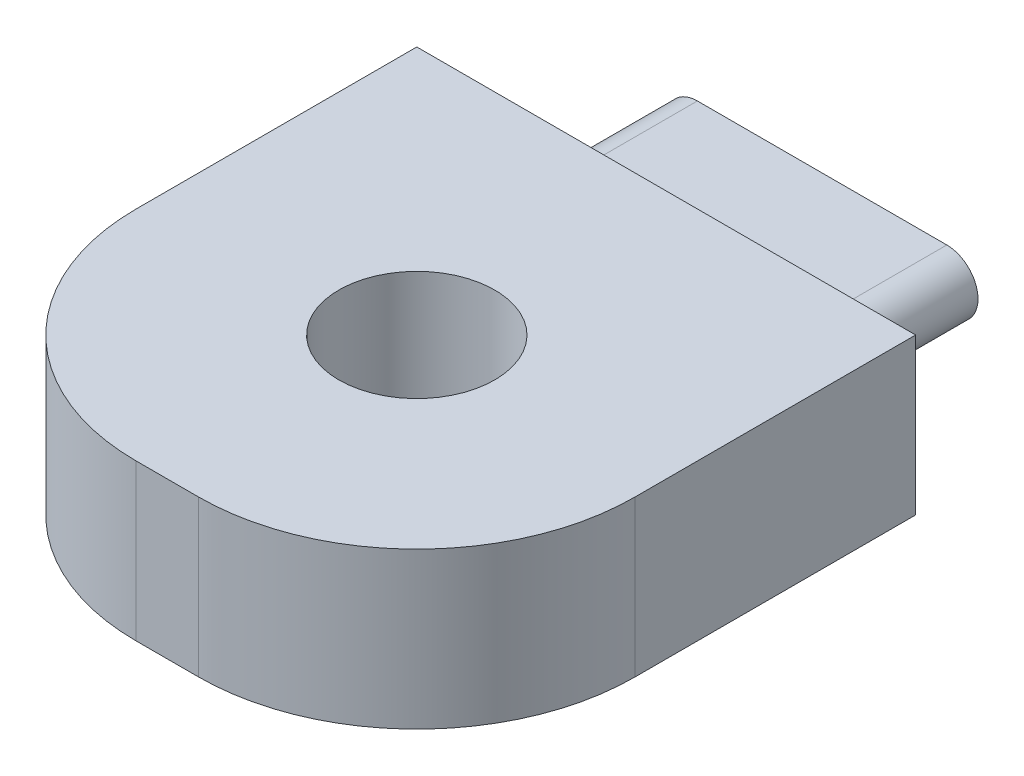
ISO-10303-21;
HEADER;
FILE_DESCRIPTION(('STEP AP214'),'2;1');
FILE_NAME('part.step','',(''),(''),'','','');
FILE_SCHEMA(('AUTOMOTIVE_DESIGN { 1 0 10303 214 1 1 1 1 }'));
ENDSEC;
DATA;
#1=APPLICATION_CONTEXT('core data for automotive mechanical design processes');
#2=APPLICATION_PROTOCOL_DEFINITION('international standard','automotive_design',2000,#1);
#3=PRODUCT_CONTEXT('',#1,'mechanical');
#4=PRODUCT('Part','Part','',(#3));
#5=PRODUCT_RELATED_PRODUCT_CATEGORY('part','',(#4));
#6=PRODUCT_DEFINITION_FORMATION('','',#4);
#7=PRODUCT_DEFINITION_CONTEXT('part definition',#1,'design');
#8=PRODUCT_DEFINITION('design','',#6,#7);
#9=PRODUCT_DEFINITION_SHAPE('','',#8);
#10=(LENGTH_UNIT() NAMED_UNIT(*) SI_UNIT(.MILLI.,.METRE.));
#11=(NAMED_UNIT(*) PLANE_ANGLE_UNIT() SI_UNIT($,.RADIAN.));
#12=(NAMED_UNIT(*) SI_UNIT($,.STERADIAN.) SOLID_ANGLE_UNIT());
#13=UNCERTAINTY_MEASURE_WITH_UNIT(LENGTH_MEASURE(1.E-05),#10,'distance_accuracy_value','');
#14=(GEOMETRIC_REPRESENTATION_CONTEXT(3) GLOBAL_UNCERTAINTY_ASSIGNED_CONTEXT((#13)) GLOBAL_UNIT_ASSIGNED_CONTEXT((#10,
#11,#12)) REPRESENTATION_CONTEXT('',''));
#15=CARTESIAN_POINT('',(0.,0.,0.));
#16=DIRECTION('',(0.,0.,1.));
#17=DIRECTION('',(1.,0.,0.));
#18=AXIS2_PLACEMENT_3D('',#15,#16,#17);
#19=CARTESIAN_POINT('',(8.,5.,0.));
#20=DIRECTION('',(0.,0.,1.));
#21=DIRECTION('',(1.,0.,0.));
#22=AXIS2_PLACEMENT_3D('',#19,#20,#21);
#23=PLANE('',#22);
#24=DIRECTION('',(-1.,0.,0.));
#25=VECTOR('',#24,1.);
#26=CARTESIAN_POINT('',(8.,0.,0.));
#27=LINE('',#26,#25);
#28=CARTESIAN_POINT('',(8.,0.,0.));
#29=VERTEX_POINT('',#28);
#30=CARTESIAN_POINT('',(-8.,0.,0.));
#31=VERTEX_POINT('',#30);
#32=EDGE_CURVE('E138',#29,#31,#27,.T.);
#33=ORIENTED_EDGE('',*,*,#32,.T.);
#34=DIRECTION('',(0.,-1.,0.));
#35=VECTOR('',#34,1.);
#36=CARTESIAN_POINT('',(-8.,5.,0.));
#37=LINE('',#36,#35);
#38=CARTESIAN_POINT('',(-8.,5.,0.));
#39=VERTEX_POINT('',#38);
#40=EDGE_CURVE('E11',#39,#31,#37,.T.);
#41=ORIENTED_EDGE('',*,*,#40,.F.);
#42=DIRECTION('',(-1.,0.,0.));
#43=VECTOR('',#42,1.);
#44=CARTESIAN_POINT('',(8.,5.,0.));
#45=LINE('',#44,#43);
#46=CARTESIAN_POINT('',(8.,5.,0.));
#47=VERTEX_POINT('',#46);
#48=EDGE_CURVE('E140',#47,#39,#45,.T.);
#49=ORIENTED_EDGE('',*,*,#48,.F.);
#50=DIRECTION('',(0.,-1.,0.));
#51=VECTOR('',#50,1.);
#52=CARTESIAN_POINT('',(8.,5.,0.));
#53=LINE('',#52,#51);
#54=EDGE_CURVE('E154',#47,#29,#53,.T.);
#55=ORIENTED_EDGE('',*,*,#54,.T.);
#56=EDGE_LOOP('',(#33,#41,#49,#55));
#57=FACE_BOUND('',#56,.T.);
#58=CARTESIAN_POINT('',(4.,2.,0.));
#59=DIRECTION('',(0.,0.,-1.));
#60=DIRECTION('',(-1.,0.,0.));
#61=AXIS2_PLACEMENT_3D('',#58,#59,#60);
#62=CIRCLE('',#61,1.);
#63=CARTESIAN_POINT('',(4.,3.,0.));
#64=VERTEX_POINT('',#63);
#65=CARTESIAN_POINT('',(4.,0.999999999999998,0.));
#66=VERTEX_POINT('',#65);
#67=EDGE_CURVE('E46',#64,#66,#62,.T.);
#68=ORIENTED_EDGE('',*,*,#67,.F.);
#69=DIRECTION('',(1.,0.,0.));
#70=VECTOR('',#69,1.);
#71=CARTESIAN_POINT('',(4.,3.,0.));
#72=LINE('',#71,#70);
#73=CARTESIAN_POINT('',(-4.,3.,0.));
#74=VERTEX_POINT('',#73);
#75=EDGE_CURVE('E50',#74,#64,#72,.T.);
#76=ORIENTED_EDGE('',*,*,#75,.F.);
#77=CARTESIAN_POINT('',(-4.,2.,0.));
#78=DIRECTION('',(0.,0.,-1.));
#79=DIRECTION('',(-1.,0.,0.));
#80=AXIS2_PLACEMENT_3D('',#77,#78,#79);
#81=CIRCLE('',#80,1.);
#82=CARTESIAN_POINT('',(-4.,1.,0.));
#83=VERTEX_POINT('',#82);
#84=EDGE_CURVE('E329',#83,#74,#81,.T.);
#85=ORIENTED_EDGE('',*,*,#84,.F.);
#86=DIRECTION('',(-1.,0.,0.));
#87=VECTOR('',#86,1.);
#88=CARTESIAN_POINT('',(4.,0.999999999999998,0.));
#89=LINE('',#88,#87);
#90=EDGE_CURVE('E335',#66,#83,#89,.T.);
#91=ORIENTED_EDGE('',*,*,#90,.F.);
#92=EDGE_LOOP('',(#68,#76,#85,#91));
#93=FACE_BOUND('',#92,.T.);
#94=ADVANCED_FACE('F32',(#57,#93),#23,.F.);
#95=CARTESIAN_POINT('',(-1.,5.,9.));
#96=DIRECTION('',(0.,1.,0.));
#97=DIRECTION('',(0.,0.,1.));
#98=AXIS2_PLACEMENT_3D('',#95,#96,#97);
#99=PLANE('',#98);
#100=ORIENTED_EDGE('',*,*,#48,.T.);
#101=DIRECTION('',(0.,0.,1.));
#102=VECTOR('',#101,1.);
#103=CARTESIAN_POINT('',(-8.,5.,0.));
#104=LINE('',#103,#102);
#105=CARTESIAN_POINT('',(-8.,5.,8.99999999999995));
#106=VERTEX_POINT('',#105);
#107=EDGE_CURVE('E143',#39,#106,#104,.T.);
#108=ORIENTED_EDGE('',*,*,#107,.T.);
#109=CARTESIAN_POINT('',(-1.,5.,9.));
#110=DIRECTION('',(0.,1.,0.));
#111=DIRECTION('',(0.,0.,1.));
#112=AXIS2_PLACEMENT_3D('',#109,#110,#111);
#113=CIRCLE('',#112,7.);
#114=CARTESIAN_POINT('',(-1.,5.,16.));
#115=VERTEX_POINT('',#114);
#116=EDGE_CURVE('E146',#106,#115,#113,.T.);
#117=ORIENTED_EDGE('',*,*,#116,.T.);
#118=DIRECTION('',(1.,0.,0.));
#119=VECTOR('',#118,1.);
#120=CARTESIAN_POINT('',(-0.999999999999954,5.,16.));
#121=LINE('',#120,#119);
#122=CARTESIAN_POINT('',(0.999999999999947,5.,16.));
#123=VERTEX_POINT('',#122);
#124=EDGE_CURVE('E148',#115,#123,#121,.T.);
#125=ORIENTED_EDGE('',*,*,#124,.T.);
#126=CARTESIAN_POINT('',(0.999999999999998,5.,9.));
#127=DIRECTION('',(0.,1.,0.));
#128=DIRECTION('',(0.,0.,1.));
#129=AXIS2_PLACEMENT_3D('',#126,#127,#128);
#130=CIRCLE('',#129,7.);
#131=CARTESIAN_POINT('',(8.,5.,8.99999999999995));
#132=VERTEX_POINT('',#131);
#133=EDGE_CURVE('E150',#123,#132,#130,.T.);
#134=ORIENTED_EDGE('',*,*,#133,.T.);
#135=DIRECTION('',(0.,0.,-1.));
#136=VECTOR('',#135,1.);
#137=CARTESIAN_POINT('',(8.,5.,0.));
#138=LINE('',#137,#136);
#139=EDGE_CURVE('E152',#132,#47,#138,.T.);
#140=ORIENTED_EDGE('',*,*,#139,.T.);
#141=EDGE_LOOP('',(#100,#108,#117,#125,#134,#140));
#142=FACE_BOUND('',#141,.T.);
#143=CARTESIAN_POINT('',(0.,5.,8.));
#144=DIRECTION('',(0.,1.,0.));
#145=DIRECTION('',(0.,0.,1.));
#146=AXIS2_PLACEMENT_3D('',#143,#144,#145);
#147=CIRCLE('',#146,2.5);
#148=CARTESIAN_POINT('',(0.,5.,10.5));
#149=VERTEX_POINT('',#148);
#150=EDGE_CURVE('E131',#149,#149,#147,.T.);
#151=ORIENTED_EDGE('',*,*,#150,.F.);
#152=EDGE_LOOP('',(#151));
#153=FACE_BOUND('',#152,.T.);
#154=ADVANCED_FACE('F201',(#142,#153),#99,.T.);
#155=CARTESIAN_POINT('',(-1.,0.,9.));
#156=DIRECTION('',(0.,1.,0.));
#157=DIRECTION('',(0.,0.,1.));
#158=AXIS2_PLACEMENT_3D('',#155,#156,#157);
#159=PLANE('',#158);
#160=ORIENTED_EDGE('',*,*,#32,.F.);
#161=DIRECTION('',(0.,0.,-1.));
#162=VECTOR('',#161,1.);
#163=CARTESIAN_POINT('',(8.,0.,0.));
#164=LINE('',#163,#162);
#165=CARTESIAN_POINT('',(8.,0.,8.99999999999995));
#166=VERTEX_POINT('',#165);
#167=EDGE_CURVE('E144',#166,#29,#164,.T.);
#168=ORIENTED_EDGE('',*,*,#167,.F.);
#169=CARTESIAN_POINT('',(0.999999999999998,0.,9.));
#170=DIRECTION('',(0.,1.,0.));
#171=DIRECTION('',(0.,0.,1.));
#172=AXIS2_PLACEMENT_3D('',#169,#170,#171);
#173=CIRCLE('',#172,7.);
#174=CARTESIAN_POINT('',(0.999999999999947,0.,16.));
#175=VERTEX_POINT('',#174);
#176=EDGE_CURVE('E163',#175,#166,#173,.T.);
#177=ORIENTED_EDGE('',*,*,#176,.F.);
#178=DIRECTION('',(1.,0.,0.));
#179=VECTOR('',#178,1.);
#180=CARTESIAN_POINT('',(-0.999999999999954,0.,16.));
#181=LINE('',#180,#179);
#182=CARTESIAN_POINT('',(-1.,0.,16.));
#183=VERTEX_POINT('',#182);
#184=EDGE_CURVE('E161',#183,#175,#181,.T.);
#185=ORIENTED_EDGE('',*,*,#184,.F.);
#186=CARTESIAN_POINT('',(-1.,0.,9.));
#187=DIRECTION('',(0.,1.,0.));
#188=DIRECTION('',(0.,0.,1.));
#189=AXIS2_PLACEMENT_3D('',#186,#187,#188);
#190=CIRCLE('',#189,7.);
#191=CARTESIAN_POINT('',(-8.,0.,8.99999999999995));
#192=VERTEX_POINT('',#191);
#193=EDGE_CURVE('E159',#192,#183,#190,.T.);
#194=ORIENTED_EDGE('',*,*,#193,.F.);
#195=DIRECTION('',(0.,0.,1.));
#196=VECTOR('',#195,1.);
#197=CARTESIAN_POINT('',(-8.,0.,0.));
#198=LINE('',#197,#196);
#199=EDGE_CURVE('E157',#31,#192,#198,.T.);
#200=ORIENTED_EDGE('',*,*,#199,.F.);
#201=EDGE_LOOP('',(#160,#168,#177,#185,#194,#200));
#202=FACE_BOUND('',#201,.T.);
#203=CARTESIAN_POINT('',(0.,0.,8.));
#204=DIRECTION('',(0.,1.,0.));
#205=DIRECTION('',(0.,0.,1.));
#206=AXIS2_PLACEMENT_3D('',#203,#204,#205);
#207=CIRCLE('',#206,2.5);
#208=CARTESIAN_POINT('',(0.,0.,10.5));
#209=VERTEX_POINT('',#208);
#210=EDGE_CURVE('E128',#209,#209,#207,.T.);
#211=ORIENTED_EDGE('',*,*,#210,.T.);
#212=EDGE_LOOP('',(#211));
#213=FACE_BOUND('',#212,.T.);
#214=ADVANCED_FACE('F187',(#202,#213),#159,.F.);
#215=CARTESIAN_POINT('',(-8.,5.,0.));
#216=DIRECTION('',(1.,0.,0.));
#217=DIRECTION('',(0.,0.,-1.));
#218=AXIS2_PLACEMENT_3D('',#215,#216,#217);
#219=PLANE('',#218);
#220=ORIENTED_EDGE('',*,*,#199,.T.);
#221=DIRECTION('',(0.,-1.,0.));
#222=VECTOR('',#221,1.);
#223=CARTESIAN_POINT('',(-8.,5.,8.99999999999995));
#224=LINE('',#223,#222);
#225=EDGE_CURVE('E39',#106,#192,#224,.T.);
#226=ORIENTED_EDGE('',*,*,#225,.F.);
#227=ORIENTED_EDGE('',*,*,#107,.F.);
#228=ORIENTED_EDGE('',*,*,#40,.T.);
#229=EDGE_LOOP('',(#220,#226,#227,#228));
#230=FACE_BOUND('',#229,.T.);
#231=ADVANCED_FACE('F206',(#230),#219,.F.);
#232=CARTESIAN_POINT('',(-1.,5.,9.));
#233=DIRECTION('',(0.,-1.,0.));
#234=DIRECTION('',(0.,0.,-1.));
#235=AXIS2_PLACEMENT_3D('',#232,#233,#234);
#236=CYLINDRICAL_SURFACE('',#235,7.);
#237=ORIENTED_EDGE('',*,*,#193,.T.);
#238=DIRECTION('',(0.,-1.,0.));
#239=VECTOR('',#238,1.);
#240=CARTESIAN_POINT('',(-1.,5.,16.));
#241=LINE('',#240,#239);
#242=EDGE_CURVE('E174',#115,#183,#241,.T.);
#243=ORIENTED_EDGE('',*,*,#242,.F.);
#244=ORIENTED_EDGE('',*,*,#116,.F.);
#245=ORIENTED_EDGE('',*,*,#225,.T.);
#246=EDGE_LOOP('',(#237,#243,#244,#245));
#247=FACE_BOUND('',#246,.T.);
#248=ADVANCED_FACE('F181',(#247),#236,.T.);
#249=CARTESIAN_POINT('',(-0.999999999999954,5.,16.));
#250=DIRECTION('',(0.,0.,-1.));
#251=DIRECTION('',(-1.,0.,0.));
#252=AXIS2_PLACEMENT_3D('',#249,#250,#251);
#253=PLANE('',#252);
#254=ORIENTED_EDGE('',*,*,#184,.T.);
#255=DIRECTION('',(0.,-1.,0.));
#256=VECTOR('',#255,1.);
#257=CARTESIAN_POINT('',(0.999999999999947,5.,16.));
#258=LINE('',#257,#256);
#259=EDGE_CURVE('E171',#123,#175,#258,.T.);
#260=ORIENTED_EDGE('',*,*,#259,.F.);
#261=ORIENTED_EDGE('',*,*,#124,.F.);
#262=ORIENTED_EDGE('',*,*,#242,.T.);
#263=EDGE_LOOP('',(#254,#260,#261,#262));
#264=FACE_BOUND('',#263,.T.);
#265=ADVANCED_FACE('F193',(#264),#253,.F.);
#266=CARTESIAN_POINT('',(0.999999999999998,5.,9.));
#267=DIRECTION('',(0.,-1.,0.));
#268=DIRECTION('',(0.,0.,-1.));
#269=AXIS2_PLACEMENT_3D('',#266,#267,#268);
#270=CYLINDRICAL_SURFACE('',#269,7.);
#271=ORIENTED_EDGE('',*,*,#176,.T.);
#272=DIRECTION('',(0.,-1.,0.));
#273=VECTOR('',#272,1.);
#274=CARTESIAN_POINT('',(8.,5.,8.99999999999995));
#275=LINE('',#274,#273);
#276=EDGE_CURVE('E168',#132,#166,#275,.T.);
#277=ORIENTED_EDGE('',*,*,#276,.F.);
#278=ORIENTED_EDGE('',*,*,#133,.F.);
#279=ORIENTED_EDGE('',*,*,#259,.T.);
#280=EDGE_LOOP('',(#271,#277,#278,#279));
#281=FACE_BOUND('',#280,.T.);
#282=ADVANCED_FACE('F197',(#281),#270,.T.);
#283=CARTESIAN_POINT('',(8.,5.,0.));
#284=DIRECTION('',(-1.,0.,0.));
#285=DIRECTION('',(0.,0.,1.));
#286=AXIS2_PLACEMENT_3D('',#283,#284,#285);
#287=PLANE('',#286);
#288=ORIENTED_EDGE('',*,*,#167,.T.);
#289=ORIENTED_EDGE('',*,*,#54,.F.);
#290=ORIENTED_EDGE('',*,*,#139,.F.);
#291=ORIENTED_EDGE('',*,*,#276,.T.);
#292=EDGE_LOOP('',(#288,#289,#290,#291));
#293=FACE_BOUND('',#292,.T.);
#294=ADVANCED_FACE('F209',(#293),#287,.F.);
#295=CARTESIAN_POINT('',(0.,5.,8.));
#296=DIRECTION('',(0.,-1.,0.));
#297=DIRECTION('',(0.,0.,-1.));
#298=AXIS2_PLACEMENT_3D('',#295,#296,#297);
#299=CYLINDRICAL_SURFACE('',#298,2.5);
#300=ORIENTED_EDGE('',*,*,#150,.T.);
#301=EDGE_LOOP('',(#300));
#302=FACE_BOUND('',#301,.T.);
#303=ORIENTED_EDGE('',*,*,#210,.F.);
#304=EDGE_LOOP('',(#303));
#305=FACE_BOUND('',#304,.T.);
#306=ADVANCED_FACE('F211',(#302,#305),#299,.F.);
#307=CARTESIAN_POINT('',(4.,2.,-5.));
#308=DIRECTION('',(0.,0.,1.));
#309=DIRECTION('',(1.,0.,0.));
#310=AXIS2_PLACEMENT_3D('',#307,#308,#309);
#311=CYLINDRICAL_SURFACE('',#310,1.);
#312=ORIENTED_EDGE('',*,*,#67,.T.);
#313=DIRECTION('',(0.,0.,1.));
#314=VECTOR('',#313,1.);
#315=CARTESIAN_POINT('',(4.,0.999999999999998,-5.));
#316=LINE('',#315,#314);
#317=CARTESIAN_POINT('',(4.,0.999999999999998,-5.));
#318=VERTEX_POINT('',#317);
#319=EDGE_CURVE('E111',#318,#66,#316,.T.);
#320=ORIENTED_EDGE('',*,*,#319,.F.);
#321=CARTESIAN_POINT('',(4.,2.,-5.));
#322=DIRECTION('',(0.,0.,-1.));
#323=DIRECTION('',(-1.,0.,0.));
#324=AXIS2_PLACEMENT_3D('',#321,#322,#323);
#325=CIRCLE('',#324,1.);
#326=CARTESIAN_POINT('',(4.,3.,-5.));
#327=VERTEX_POINT('',#326);
#328=EDGE_CURVE('E117',#327,#318,#325,.T.);
#329=ORIENTED_EDGE('',*,*,#328,.F.);
#330=DIRECTION('',(0.,0.,1.));
#331=VECTOR('',#330,1.);
#332=CARTESIAN_POINT('',(4.,3.,-5.));
#333=LINE('',#332,#331);
#334=EDGE_CURVE('E327',#327,#64,#333,.T.);
#335=ORIENTED_EDGE('',*,*,#334,.T.);
#336=EDGE_LOOP('',(#312,#320,#329,#335));
#337=FACE_BOUND('',#336,.T.);
#338=ADVANCED_FACE('F127',(#337),#311,.T.);
#339=CARTESIAN_POINT('',(4.,0.999999999999998,-5.));
#340=DIRECTION('',(0.,1.,0.));
#341=DIRECTION('',(0.,0.,1.));
#342=AXIS2_PLACEMENT_3D('',#339,#340,#341);
#343=PLANE('',#342);
#344=ORIENTED_EDGE('',*,*,#90,.T.);
#345=DIRECTION('',(0.,0.,1.));
#346=VECTOR('',#345,1.);
#347=CARTESIAN_POINT('',(-4.,1.,-5.));
#348=LINE('',#347,#346);
#349=CARTESIAN_POINT('',(-4.,1.,-5.));
#350=VERTEX_POINT('',#349);
#351=EDGE_CURVE('E113',#350,#83,#348,.T.);
#352=ORIENTED_EDGE('',*,*,#351,.F.);
#353=DIRECTION('',(-1.,0.,0.));
#354=VECTOR('',#353,1.);
#355=CARTESIAN_POINT('',(4.,0.999999999999998,-5.));
#356=LINE('',#355,#354);
#357=EDGE_CURVE('E106',#318,#350,#356,.T.);
#358=ORIENTED_EDGE('',*,*,#357,.F.);
#359=ORIENTED_EDGE('',*,*,#319,.T.);
#360=EDGE_LOOP('',(#344,#352,#358,#359));
#361=FACE_BOUND('',#360,.T.);
#362=ADVANCED_FACE('F109',(#361),#343,.F.);
#363=CARTESIAN_POINT('',(-4.,2.,-5.));
#364=DIRECTION('',(0.,0.,1.));
#365=DIRECTION('',(1.,0.,0.));
#366=AXIS2_PLACEMENT_3D('',#363,#364,#365);
#367=CYLINDRICAL_SURFACE('',#366,1.);
#368=ORIENTED_EDGE('',*,*,#84,.T.);
#369=DIRECTION('',(0.,0.,1.));
#370=VECTOR('',#369,1.);
#371=CARTESIAN_POINT('',(-4.,3.,-5.));
#372=LINE('',#371,#370);
#373=CARTESIAN_POINT('',(-4.,3.,-5.));
#374=VERTEX_POINT('',#373);
#375=EDGE_CURVE('E133',#374,#74,#372,.T.);
#376=ORIENTED_EDGE('',*,*,#375,.F.);
#377=CARTESIAN_POINT('',(-4.,2.,-5.));
#378=DIRECTION('',(0.,0.,-1.));
#379=DIRECTION('',(-1.,0.,0.));
#380=AXIS2_PLACEMENT_3D('',#377,#378,#379);
#381=CIRCLE('',#380,1.);
#382=EDGE_CURVE('E116',#350,#374,#381,.T.);
#383=ORIENTED_EDGE('',*,*,#382,.F.);
#384=ORIENTED_EDGE('',*,*,#351,.T.);
#385=EDGE_LOOP('',(#368,#376,#383,#384));
#386=FACE_BOUND('',#385,.T.);
#387=ADVANCED_FACE('F234',(#386),#367,.T.);
#388=CARTESIAN_POINT('',(4.,3.,-5.));
#389=DIRECTION('',(0.,-1.,0.));
#390=DIRECTION('',(0.,0.,-1.));
#391=AXIS2_PLACEMENT_3D('',#388,#389,#390);
#392=PLANE('',#391);
#393=ORIENTED_EDGE('',*,*,#75,.T.);
#394=ORIENTED_EDGE('',*,*,#334,.F.);
#395=DIRECTION('',(1.,0.,0.));
#396=VECTOR('',#395,1.);
#397=CARTESIAN_POINT('',(4.,3.,-5.));
#398=LINE('',#397,#396);
#399=EDGE_CURVE('E122',#374,#327,#398,.T.);
#400=ORIENTED_EDGE('',*,*,#399,.F.);
#401=ORIENTED_EDGE('',*,*,#375,.T.);
#402=EDGE_LOOP('',(#393,#394,#400,#401));
#403=FACE_BOUND('',#402,.T.);
#404=ADVANCED_FACE('F237',(#403),#392,.F.);
#405=CARTESIAN_POINT('',(4.,2.,-5.));
#406=DIRECTION('',(0.,0.,-1.));
#407=DIRECTION('',(-1.,0.,0.));
#408=AXIS2_PLACEMENT_3D('',#405,#406,#407);
#409=PLANE('',#408);
#410=ORIENTED_EDGE('',*,*,#328,.T.);
#411=ORIENTED_EDGE('',*,*,#357,.T.);
#412=ORIENTED_EDGE('',*,*,#382,.T.);
#413=ORIENTED_EDGE('',*,*,#399,.T.);
#414=EDGE_LOOP('',(#410,#411,#412,#413));
#415=FACE_BOUND('',#414,.T.);
#416=ADVANCED_FACE('F120',(#415),#409,.T.);
#417=CLOSED_SHELL('',(#94,#154,#214,#231,#248,#265,#282,#294,#306,#338,#362,#387,#404,#416));
#418=MANIFOLD_SOLID_BREP('B2',#417);
#419=ADVANCED_BREP_SHAPE_REPRESENTATION('',(#18,#418),#14);
#420=SHAPE_DEFINITION_REPRESENTATION(#9,#419);
ENDSEC;
END-ISO-10303-21;
